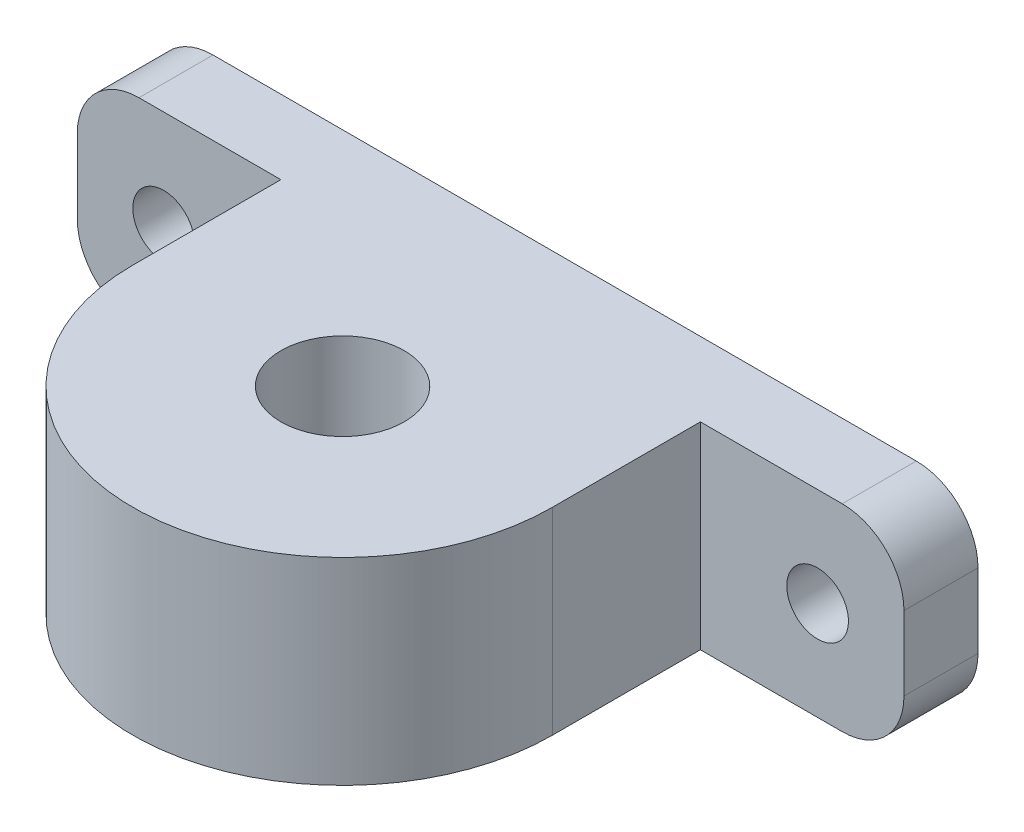
ISO-10303-21;
HEADER;
FILE_DESCRIPTION(('STEP AP214'),'2;1');
FILE_NAME('part.step','',(''),(''),'','','');
FILE_SCHEMA(('AUTOMOTIVE_DESIGN { 1 0 10303 214 1 1 1 1 }'));
ENDSEC;
DATA;
#1=APPLICATION_CONTEXT('core data for automotive mechanical design processes');
#2=APPLICATION_PROTOCOL_DEFINITION('international standard','automotive_design',2000,#1);
#3=PRODUCT_CONTEXT('',#1,'mechanical');
#4=PRODUCT('Part','Part','',(#3));
#5=PRODUCT_RELATED_PRODUCT_CATEGORY('part','',(#4));
#6=PRODUCT_DEFINITION_FORMATION('','',#4);
#7=PRODUCT_DEFINITION_CONTEXT('part definition',#1,'design');
#8=PRODUCT_DEFINITION('design','',#6,#7);
#9=PRODUCT_DEFINITION_SHAPE('','',#8);
#10=(LENGTH_UNIT() NAMED_UNIT(*) SI_UNIT(.MILLI.,.METRE.));
#11=(NAMED_UNIT(*) PLANE_ANGLE_UNIT() SI_UNIT($,.RADIAN.));
#12=(NAMED_UNIT(*) SI_UNIT($,.STERADIAN.) SOLID_ANGLE_UNIT());
#13=UNCERTAINTY_MEASURE_WITH_UNIT(LENGTH_MEASURE(1.E-05),#10,'distance_accuracy_value','');
#14=(GEOMETRIC_REPRESENTATION_CONTEXT(3) GLOBAL_UNCERTAINTY_ASSIGNED_CONTEXT((#13)) GLOBAL_UNIT_ASSIGNED_CONTEXT((#10,
#11,#12)) REPRESENTATION_CONTEXT('',''));
#15=CARTESIAN_POINT('',(0.,0.,0.));
#16=DIRECTION('',(0.,0.,1.));
#17=DIRECTION('',(1.,0.,0.));
#18=AXIS2_PLACEMENT_3D('',#15,#16,#17);
#19=CARTESIAN_POINT('',(-28.5,5.,-9.25000000000002));
#20=DIRECTION('',(0.,0.,-1.));
#21=DIRECTION('',(-1.,0.,0.));
#22=AXIS2_PLACEMENT_3D('',#19,#20,#21);
#23=CYLINDRICAL_SURFACE('',#22,5.);
#24=CARTESIAN_POINT('',(-28.5,5.,-12.));
#25=DIRECTION('',(0.,0.,-1.));
#26=DIRECTION('',(-1.,0.,0.));
#27=AXIS2_PLACEMENT_3D('',#24,#25,#26);
#28=CIRCLE('',#27,5.);
#29=CARTESIAN_POINT('',(-33.5,5.,-12.));
#30=VERTEX_POINT('',#29);
#31=CARTESIAN_POINT('',(-28.5,0.,-12.));
#32=VERTEX_POINT('',#31);
#33=EDGE_CURVE('E172',#30,#32,#28,.F.);
#34=ORIENTED_EDGE('',*,*,#33,.F.);
#35=DIRECTION('',(0.,0.,1.));
#36=VECTOR('',#35,1.);
#37=CARTESIAN_POINT('',(-33.5,5.,-18.));
#38=LINE('',#37,#36);
#39=CARTESIAN_POINT('',(-33.5,5.,-18.));
#40=VERTEX_POINT('',#39);
#41=EDGE_CURVE('E188',#40,#30,#38,.T.);
#42=ORIENTED_EDGE('',*,*,#41,.F.);
#43=CARTESIAN_POINT('',(-28.5,5.,-18.));
#44=DIRECTION('',(0.,0.,-1.));
#45=DIRECTION('',(-1.,0.,0.));
#46=AXIS2_PLACEMENT_3D('',#43,#44,#45);
#47=CIRCLE('',#46,5.);
#48=CARTESIAN_POINT('',(-28.5,0.,-18.));
#49=VERTEX_POINT('',#48);
#50=EDGE_CURVE('E179',#49,#40,#47,.T.);
#51=ORIENTED_EDGE('',*,*,#50,.F.);
#52=DIRECTION('',(0.,0.,1.));
#53=VECTOR('',#52,1.);
#54=CARTESIAN_POINT('',(-28.5,0.,-0.499999999999998));
#55=LINE('',#54,#53);
#56=EDGE_CURVE('E187',#49,#32,#55,.T.);
#57=ORIENTED_EDGE('',*,*,#56,.T.);
#58=EDGE_LOOP('',(#34,#42,#51,#57));
#59=FACE_BOUND('',#58,.T.);
#60=ADVANCED_FACE('F16',(#59),#23,.T.);
#61=CARTESIAN_POINT('',(-33.5,0.,-18.));
#62=DIRECTION('',(-1.,0.,0.));
#63=DIRECTION('',(0.,0.,1.));
#64=AXIS2_PLACEMENT_3D('',#61,#62,#63);
#65=PLANE('',#64);
#66=DIRECTION('',(0.,0.,1.));
#67=VECTOR('',#66,1.);
#68=CARTESIAN_POINT('',(-33.5,11.,-9.25000000000003));
#69=LINE('',#68,#67);
#70=CARTESIAN_POINT('',(-33.5,11.,-18.));
#71=VERTEX_POINT('',#70);
#72=CARTESIAN_POINT('',(-33.5,11.,-12.));
#73=VERTEX_POINT('',#72);
#74=EDGE_CURVE('E201',#71,#73,#69,.T.);
#75=ORIENTED_EDGE('',*,*,#74,.F.);
#76=DIRECTION('',(0.,1.,0.));
#77=VECTOR('',#76,1.);
#78=CARTESIAN_POINT('',(-33.5,0.,-18.));
#79=LINE('',#78,#77);
#80=EDGE_CURVE('E176',#40,#71,#79,.T.);
#81=ORIENTED_EDGE('',*,*,#80,.F.);
#82=ORIENTED_EDGE('',*,*,#41,.T.);
#83=DIRECTION('',(0.,1.,0.));
#84=VECTOR('',#83,1.);
#85=CARTESIAN_POINT('',(-33.5,0.,-12.));
#86=LINE('',#85,#84);
#87=EDGE_CURVE('E164',#73,#30,#86,.F.);
#88=ORIENTED_EDGE('',*,*,#87,.F.);
#89=EDGE_LOOP('',(#75,#81,#82,#88));
#90=FACE_BOUND('',#89,.T.);
#91=ADVANCED_FACE('F247',(#90),#65,.T.);
#92=CARTESIAN_POINT('',(-26.5,8.,-12.));
#93=DIRECTION('',(0.,0.,-1.));
#94=DIRECTION('',(-1.,0.,0.));
#95=AXIS2_PLACEMENT_3D('',#92,#93,#94);
#96=CYLINDRICAL_SURFACE('',#95,2.5);
#97=CARTESIAN_POINT('',(-26.5,8.,-18.));
#98=DIRECTION('',(0.,0.,-1.));
#99=DIRECTION('',(-1.,0.,0.));
#100=AXIS2_PLACEMENT_3D('',#97,#98,#99);
#101=CIRCLE('',#100,2.5);
#102=CARTESIAN_POINT('',(-29.,8.,-18.));
#103=VERTEX_POINT('',#102);
#104=EDGE_CURVE('E178',#103,#103,#101,.F.);
#105=ORIENTED_EDGE('',*,*,#104,.F.);
#106=EDGE_LOOP('',(#105));
#107=FACE_BOUND('',#106,.T.);
#108=CARTESIAN_POINT('',(-26.5,8.,-12.));
#109=DIRECTION('',(0.,0.,-1.));
#110=DIRECTION('',(-1.,0.,0.));
#111=AXIS2_PLACEMENT_3D('',#108,#109,#110);
#112=CIRCLE('',#111,2.5);
#113=CARTESIAN_POINT('',(-29.,8.,-12.));
#114=VERTEX_POINT('',#113);
#115=EDGE_CURVE('E167',#114,#114,#112,.T.);
#116=ORIENTED_EDGE('',*,*,#115,.F.);
#117=EDGE_LOOP('',(#116));
#118=FACE_BOUND('',#117,.T.);
#119=ADVANCED_FACE('F314',(#107,#118),#96,.F.);
#120=CARTESIAN_POINT('',(28.5,5.,-6.25));
#121=DIRECTION('',(0.,0.,1.));
#122=DIRECTION('',(1.,0.,0.));
#123=AXIS2_PLACEMENT_3D('',#120,#121,#122);
#124=CYLINDRICAL_SURFACE('',#123,5.);
#125=CARTESIAN_POINT('',(28.5,5.,-18.));
#126=DIRECTION('',(0.,0.,1.));
#127=DIRECTION('',(1.,0.,0.));
#128=AXIS2_PLACEMENT_3D('',#125,#126,#127);
#129=CIRCLE('',#128,5.);
#130=CARTESIAN_POINT('',(33.5,5.,-18.));
#131=VERTEX_POINT('',#130);
#132=CARTESIAN_POINT('',(28.5,0.,-18.));
#133=VERTEX_POINT('',#132);
#134=EDGE_CURVE('E183',#131,#133,#129,.F.);
#135=ORIENTED_EDGE('',*,*,#134,.F.);
#136=DIRECTION('',(0.,0.,-1.));
#137=VECTOR('',#136,1.);
#138=CARTESIAN_POINT('',(33.5,5.,-12.));
#139=LINE('',#138,#137);
#140=CARTESIAN_POINT('',(33.5,5.,-12.));
#141=VERTEX_POINT('',#140);
#142=EDGE_CURVE('E185',#141,#131,#139,.T.);
#143=ORIENTED_EDGE('',*,*,#142,.F.);
#144=CARTESIAN_POINT('',(28.5,5.,-12.));
#145=DIRECTION('',(0.,0.,1.));
#146=DIRECTION('',(1.,0.,0.));
#147=AXIS2_PLACEMENT_3D('',#144,#145,#146);
#148=CIRCLE('',#147,5.);
#149=CARTESIAN_POINT('',(28.5,0.,-12.));
#150=VERTEX_POINT('',#149);
#151=EDGE_CURVE('E210',#150,#141,#148,.T.);
#152=ORIENTED_EDGE('',*,*,#151,.F.);
#153=DIRECTION('',(0.,0.,1.));
#154=VECTOR('',#153,1.);
#155=CARTESIAN_POINT('',(28.5,0.,-0.499999999999998));
#156=LINE('',#155,#154);
#157=EDGE_CURVE('E189',#150,#133,#156,.F.);
#158=ORIENTED_EDGE('',*,*,#157,.T.);
#159=EDGE_LOOP('',(#135,#143,#152,#158));
#160=FACE_BOUND('',#159,.T.);
#161=ADVANCED_FACE('F233',(#160),#124,.T.);
#162=CARTESIAN_POINT('',(33.5,0.,-12.));
#163=DIRECTION('',(1.,0.,0.));
#164=DIRECTION('',(0.,0.,-1.));
#165=AXIS2_PLACEMENT_3D('',#162,#163,#164);
#166=PLANE('',#165);
#167=ORIENTED_EDGE('',*,*,#142,.T.);
#168=DIRECTION('',(0.,1.,0.));
#169=VECTOR('',#168,1.);
#170=CARTESIAN_POINT('',(33.5,0.,-18.));
#171=LINE('',#170,#169);
#172=CARTESIAN_POINT('',(33.5,11.,-18.));
#173=VERTEX_POINT('',#172);
#174=EDGE_CURVE('E112',#173,#131,#171,.F.);
#175=ORIENTED_EDGE('',*,*,#174,.F.);
#176=DIRECTION('',(0.,0.,-1.));
#177=VECTOR('',#176,1.);
#178=CARTESIAN_POINT('',(33.5,11.,-6.25));
#179=LINE('',#178,#177);
#180=CARTESIAN_POINT('',(33.5,11.,-12.));
#181=VERTEX_POINT('',#180);
#182=EDGE_CURVE('E108',#181,#173,#179,.T.);
#183=ORIENTED_EDGE('',*,*,#182,.F.);
#184=DIRECTION('',(0.,1.,0.));
#185=VECTOR('',#184,1.);
#186=CARTESIAN_POINT('',(33.5,0.,-12.));
#187=LINE('',#186,#185);
#188=EDGE_CURVE('E209',#141,#181,#187,.T.);
#189=ORIENTED_EDGE('',*,*,#188,.F.);
#190=EDGE_LOOP('',(#167,#175,#183,#189));
#191=FACE_BOUND('',#190,.T.);
#192=ADVANCED_FACE('F304',(#191),#166,.T.);
#193=CARTESIAN_POINT('',(26.5,8.,-12.));
#194=DIRECTION('',(0.,0.,-1.));
#195=DIRECTION('',(-1.,0.,0.));
#196=AXIS2_PLACEMENT_3D('',#193,#194,#195);
#197=CYLINDRICAL_SURFACE('',#196,2.5);
#198=CARTESIAN_POINT('',(26.5,8.,-18.));
#199=DIRECTION('',(0.,0.,-1.));
#200=DIRECTION('',(-1.,0.,0.));
#201=AXIS2_PLACEMENT_3D('',#198,#199,#200);
#202=CIRCLE('',#201,2.5);
#203=CARTESIAN_POINT('',(24.,8.,-18.));
#204=VERTEX_POINT('',#203);
#205=EDGE_CURVE('E223',#204,#204,#202,.F.);
#206=ORIENTED_EDGE('',*,*,#205,.F.);
#207=EDGE_LOOP('',(#206));
#208=FACE_BOUND('',#207,.T.);
#209=CARTESIAN_POINT('',(26.5,8.,-12.));
#210=DIRECTION('',(0.,0.,-1.));
#211=DIRECTION('',(-1.,0.,0.));
#212=AXIS2_PLACEMENT_3D('',#209,#210,#211);
#213=CIRCLE('',#212,2.5);
#214=CARTESIAN_POINT('',(24.,8.,-12.));
#215=VERTEX_POINT('',#214);
#216=EDGE_CURVE('E129',#215,#215,#213,.T.);
#217=ORIENTED_EDGE('',*,*,#216,.F.);
#218=EDGE_LOOP('',(#217));
#219=FACE_BOUND('',#218,.T.);
#220=ADVANCED_FACE('F297',(#208,#219),#197,.F.);
#221=CARTESIAN_POINT('',(0.,0.,-0.499999999999998));
#222=DIRECTION('',(0.,1.,0.));
#223=DIRECTION('',(0.,0.,1.));
#224=AXIS2_PLACEMENT_3D('',#221,#222,#223);
#225=PLANE('',#224);
#226=CARTESIAN_POINT('',(0.,0.,0.));
#227=DIRECTION('',(0.,1.,0.));
#228=DIRECTION('',(0.,0.,1.));
#229=AXIS2_PLACEMENT_3D('',#226,#227,#228);
#230=CIRCLE('',#229,5.);
#231=CARTESIAN_POINT('',(0.,0.,5.));
#232=VERTEX_POINT('',#231);
#233=EDGE_CURVE('E126',#232,#232,#230,.T.);
#234=ORIENTED_EDGE('',*,*,#233,.T.);
#235=EDGE_LOOP('',(#234));
#236=FACE_BOUND('',#235,.T.);
#237=DIRECTION('',(1.,0.,0.));
#238=VECTOR('',#237,1.);
#239=CARTESIAN_POINT('',(17.,0.,-12.));
#240=LINE('',#239,#238);
#241=CARTESIAN_POINT('',(17.,0.,-12.));
#242=VERTEX_POINT('',#241);
#243=EDGE_CURVE('E140',#242,#150,#240,.T.);
#244=ORIENTED_EDGE('',*,*,#243,.F.);
#245=DIRECTION('',(0.,0.,-1.));
#246=VECTOR('',#245,1.);
#247=CARTESIAN_POINT('',(17.,0.,0.));
#248=LINE('',#247,#246);
#249=CARTESIAN_POINT('',(17.,0.,0.));
#250=VERTEX_POINT('',#249);
#251=EDGE_CURVE('E147',#250,#242,#248,.T.);
#252=ORIENTED_EDGE('',*,*,#251,.F.);
#253=CARTESIAN_POINT('',(0.,0.,0.));
#254=DIRECTION('',(0.,1.,0.));
#255=DIRECTION('',(0.,0.,1.));
#256=AXIS2_PLACEMENT_3D('',#253,#254,#255);
#257=CIRCLE('',#256,17.);
#258=CARTESIAN_POINT('',(-17.,0.,0.));
#259=VERTEX_POINT('',#258);
#260=EDGE_CURVE('E151',#259,#250,#257,.T.);
#261=ORIENTED_EDGE('',*,*,#260,.F.);
#262=DIRECTION('',(0.,0.,1.));
#263=VECTOR('',#262,1.);
#264=CARTESIAN_POINT('',(-17.,0.,-12.));
#265=LINE('',#264,#263);
#266=CARTESIAN_POINT('',(-17.,0.,-12.));
#267=VERTEX_POINT('',#266);
#268=EDGE_CURVE('E155',#267,#259,#265,.T.);
#269=ORIENTED_EDGE('',*,*,#268,.F.);
#270=DIRECTION('',(1.,0.,0.));
#271=VECTOR('',#270,1.);
#272=CARTESIAN_POINT('',(-33.5,0.,-12.));
#273=LINE('',#272,#271);
#274=EDGE_CURVE('E169',#32,#267,#273,.T.);
#275=ORIENTED_EDGE('',*,*,#274,.F.);
#276=ORIENTED_EDGE('',*,*,#56,.F.);
#277=DIRECTION('',(-1.,0.,0.));
#278=VECTOR('',#277,1.);
#279=CARTESIAN_POINT('',(33.5,0.,-18.));
#280=LINE('',#279,#278);
#281=EDGE_CURVE('E180',#133,#49,#280,.T.);
#282=ORIENTED_EDGE('',*,*,#281,.F.);
#283=ORIENTED_EDGE('',*,*,#157,.F.);
#284=EDGE_LOOP('',(#244,#252,#261,#269,#275,#276,#282,#283));
#285=FACE_BOUND('',#284,.T.);
#286=ADVANCED_FACE('F239',(#236,#285),#225,.F.);
#287=CARTESIAN_POINT('',(28.5,11.,-6.25));
#288=DIRECTION('',(0.,0.,-1.));
#289=DIRECTION('',(-1.,0.,0.));
#290=AXIS2_PLACEMENT_3D('',#287,#288,#289);
#291=CYLINDRICAL_SURFACE('',#290,5.);
#292=CARTESIAN_POINT('',(28.5,11.,-12.));
#293=DIRECTION('',(0.,0.,-1.));
#294=DIRECTION('',(-1.,0.,0.));
#295=AXIS2_PLACEMENT_3D('',#292,#293,#294);
#296=CIRCLE('',#295,5.);
#297=CARTESIAN_POINT('',(28.5,16.,-12.));
#298=VERTEX_POINT('',#297);
#299=EDGE_CURVE('E141',#181,#298,#296,.F.);
#300=ORIENTED_EDGE('',*,*,#299,.F.);
#301=ORIENTED_EDGE('',*,*,#182,.T.);
#302=CARTESIAN_POINT('',(28.5,11.,-18.));
#303=DIRECTION('',(0.,0.,-1.));
#304=DIRECTION('',(-1.,0.,0.));
#305=AXIS2_PLACEMENT_3D('',#302,#303,#304);
#306=CIRCLE('',#305,5.);
#307=CARTESIAN_POINT('',(28.5,16.,-18.));
#308=VERTEX_POINT('',#307);
#309=EDGE_CURVE('E19',#308,#173,#306,.T.);
#310=ORIENTED_EDGE('',*,*,#309,.F.);
#311=DIRECTION('',(0.,0.,1.));
#312=VECTOR('',#311,1.);
#313=CARTESIAN_POINT('',(28.5,16.,-0.499999999999998));
#314=LINE('',#313,#312);
#315=EDGE_CURVE('E106',#298,#308,#314,.F.);
#316=ORIENTED_EDGE('',*,*,#315,.F.);
#317=EDGE_LOOP('',(#300,#301,#310,#316));
#318=FACE_BOUND('',#317,.T.);
#319=ADVANCED_FACE('F104',(#318),#291,.T.);
#320=CARTESIAN_POINT('',(33.5,0.,-18.));
#321=DIRECTION('',(0.,0.,-1.));
#322=DIRECTION('',(-1.,0.,0.));
#323=AXIS2_PLACEMENT_3D('',#320,#321,#322);
#324=PLANE('',#323);
#325=ORIENTED_EDGE('',*,*,#205,.T.);
#326=EDGE_LOOP('',(#325));
#327=FACE_BOUND('',#326,.T.);
#328=ORIENTED_EDGE('',*,*,#104,.T.);
#329=EDGE_LOOP('',(#328));
#330=FACE_BOUND('',#329,.T.);
#331=CARTESIAN_POINT('',(-28.5,11.,-18.));
#332=DIRECTION('',(0.,0.,1.));
#333=DIRECTION('',(1.,0.,0.));
#334=AXIS2_PLACEMENT_3D('',#331,#332,#333);
#335=CIRCLE('',#334,5.);
#336=CARTESIAN_POINT('',(-28.5,16.,-18.));
#337=VERTEX_POINT('',#336);
#338=EDGE_CURVE('E117',#337,#71,#335,.T.);
#339=ORIENTED_EDGE('',*,*,#338,.F.);
#340=DIRECTION('',(1.,0.,0.));
#341=VECTOR('',#340,1.);
#342=CARTESIAN_POINT('',(0.,16.,-18.));
#343=LINE('',#342,#341);
#344=EDGE_CURVE('E114',#308,#337,#343,.F.);
#345=ORIENTED_EDGE('',*,*,#344,.F.);
#346=ORIENTED_EDGE('',*,*,#309,.T.);
#347=ORIENTED_EDGE('',*,*,#174,.T.);
#348=ORIENTED_EDGE('',*,*,#134,.T.);
#349=ORIENTED_EDGE('',*,*,#281,.T.);
#350=ORIENTED_EDGE('',*,*,#50,.T.);
#351=ORIENTED_EDGE('',*,*,#80,.T.);
#352=EDGE_LOOP('',(#339,#345,#346,#347,#348,#349,#350,#351));
#353=FACE_BOUND('',#352,.T.);
#354=ADVANCED_FACE('F115',(#327,#330,#353),#324,.T.);
#355=CARTESIAN_POINT('',(-28.5,11.,-9.25000000000002));
#356=DIRECTION('',(0.,0.,1.));
#357=DIRECTION('',(1.,0.,0.));
#358=AXIS2_PLACEMENT_3D('',#355,#356,#357);
#359=CYLINDRICAL_SURFACE('',#358,5.);
#360=ORIENTED_EDGE('',*,*,#338,.T.);
#361=ORIENTED_EDGE('',*,*,#74,.T.);
#362=CARTESIAN_POINT('',(-28.5,11.,-12.));
#363=DIRECTION('',(0.,0.,1.));
#364=DIRECTION('',(1.,0.,0.));
#365=AXIS2_PLACEMENT_3D('',#362,#363,#364);
#366=CIRCLE('',#365,5.);
#367=CARTESIAN_POINT('',(-28.5,16.,-12.));
#368=VERTEX_POINT('',#367);
#369=EDGE_CURVE('E168',#368,#73,#366,.T.);
#370=ORIENTED_EDGE('',*,*,#369,.F.);
#371=DIRECTION('',(0.,0.,1.));
#372=VECTOR('',#371,1.);
#373=CARTESIAN_POINT('',(-28.5,16.,-0.499999999999998));
#374=LINE('',#373,#372);
#375=EDGE_CURVE('E121',#337,#368,#374,.T.);
#376=ORIENTED_EDGE('',*,*,#375,.F.);
#377=EDGE_LOOP('',(#360,#361,#370,#376));
#378=FACE_BOUND('',#377,.T.);
#379=ADVANCED_FACE('F249',(#378),#359,.T.);
#380=CARTESIAN_POINT('',(-33.5,0.,-12.));
#381=DIRECTION('',(0.,0.,1.));
#382=DIRECTION('',(1.,0.,0.));
#383=AXIS2_PLACEMENT_3D('',#380,#381,#382);
#384=PLANE('',#383);
#385=ORIENTED_EDGE('',*,*,#115,.T.);
#386=EDGE_LOOP('',(#385));
#387=FACE_BOUND('',#386,.T.);
#388=ORIENTED_EDGE('',*,*,#369,.T.);
#389=ORIENTED_EDGE('',*,*,#87,.T.);
#390=ORIENTED_EDGE('',*,*,#33,.T.);
#391=ORIENTED_EDGE('',*,*,#274,.T.);
#392=DIRECTION('',(0.,1.,0.));
#393=VECTOR('',#392,1.);
#394=CARTESIAN_POINT('',(-17.,0.,-12.));
#395=LINE('',#394,#393);
#396=CARTESIAN_POINT('',(-17.,16.,-12.));
#397=VERTEX_POINT('',#396);
#398=EDGE_CURVE('E152',#397,#267,#395,.F.);
#399=ORIENTED_EDGE('',*,*,#398,.F.);
#400=DIRECTION('',(1.,0.,0.));
#401=VECTOR('',#400,1.);
#402=CARTESIAN_POINT('',(0.,16.,-12.));
#403=LINE('',#402,#401);
#404=EDGE_CURVE('E158',#368,#397,#403,.T.);
#405=ORIENTED_EDGE('',*,*,#404,.F.);
#406=EDGE_LOOP('',(#388,#389,#390,#391,#399,#405));
#407=FACE_BOUND('',#406,.T.);
#408=ADVANCED_FACE('F254',(#387,#407),#384,.T.);
#409=CARTESIAN_POINT('',(-17.,0.,-12.));
#410=DIRECTION('',(-1.,0.,0.));
#411=DIRECTION('',(0.,0.,1.));
#412=AXIS2_PLACEMENT_3D('',#409,#410,#411);
#413=PLANE('',#412);
#414=DIRECTION('',(0.,0.,1.));
#415=VECTOR('',#414,1.);
#416=CARTESIAN_POINT('',(-17.,16.,-0.499999999999998));
#417=LINE('',#416,#415);
#418=CARTESIAN_POINT('',(-17.,16.,0.));
#419=VERTEX_POINT('',#418);
#420=EDGE_CURVE('E161',#397,#419,#417,.T.);
#421=ORIENTED_EDGE('',*,*,#420,.F.);
#422=ORIENTED_EDGE('',*,*,#398,.T.);
#423=ORIENTED_EDGE('',*,*,#268,.T.);
#424=DIRECTION('',(0.,1.,0.));
#425=VECTOR('',#424,1.);
#426=CARTESIAN_POINT('',(-17.,0.,0.));
#427=LINE('',#426,#425);
#428=EDGE_CURVE('E148',#419,#259,#427,.F.);
#429=ORIENTED_EDGE('',*,*,#428,.F.);
#430=EDGE_LOOP('',(#421,#422,#423,#429));
#431=FACE_BOUND('',#430,.T.);
#432=ADVANCED_FACE('F256',(#431),#413,.T.);
#433=CARTESIAN_POINT('',(0.,0.,0.));
#434=DIRECTION('',(0.,1.,0.));
#435=DIRECTION('',(0.,0.,1.));
#436=AXIS2_PLACEMENT_3D('',#433,#434,#435);
#437=CYLINDRICAL_SURFACE('',#436,17.);
#438=CARTESIAN_POINT('',(0.,16.,0.));
#439=DIRECTION('',(0.,1.,0.));
#440=DIRECTION('',(0.,0.,1.));
#441=AXIS2_PLACEMENT_3D('',#438,#439,#440);
#442=CIRCLE('',#441,17.);
#443=CARTESIAN_POINT('',(17.,16.,0.));
#444=VERTEX_POINT('',#443);
#445=EDGE_CURVE('E204',#419,#444,#442,.T.);
#446=ORIENTED_EDGE('',*,*,#445,.F.);
#447=ORIENTED_EDGE('',*,*,#428,.T.);
#448=ORIENTED_EDGE('',*,*,#260,.T.);
#449=DIRECTION('',(0.,1.,0.));
#450=VECTOR('',#449,1.);
#451=CARTESIAN_POINT('',(17.,0.,0.));
#452=LINE('',#451,#450);
#453=EDGE_CURVE('E144',#444,#250,#452,.F.);
#454=ORIENTED_EDGE('',*,*,#453,.F.);
#455=EDGE_LOOP('',(#446,#447,#448,#454));
#456=FACE_BOUND('',#455,.T.);
#457=ADVANCED_FACE('F269',(#456),#437,.T.);
#458=CARTESIAN_POINT('',(17.,0.,0.));
#459=DIRECTION('',(1.,0.,0.));
#460=DIRECTION('',(0.,0.,-1.));
#461=AXIS2_PLACEMENT_3D('',#458,#459,#460);
#462=PLANE('',#461);
#463=DIRECTION('',(0.,0.,1.));
#464=VECTOR('',#463,1.);
#465=CARTESIAN_POINT('',(17.,16.,-0.499999999999998));
#466=LINE('',#465,#464);
#467=CARTESIAN_POINT('',(17.,16.,-12.));
#468=VERTEX_POINT('',#467);
#469=EDGE_CURVE('E136',#444,#468,#466,.F.);
#470=ORIENTED_EDGE('',*,*,#469,.F.);
#471=ORIENTED_EDGE('',*,*,#453,.T.);
#472=ORIENTED_EDGE('',*,*,#251,.T.);
#473=DIRECTION('',(0.,1.,0.));
#474=VECTOR('',#473,1.);
#475=CARTESIAN_POINT('',(17.,0.,-12.));
#476=LINE('',#475,#474);
#477=EDGE_CURVE('E34',#468,#242,#476,.F.);
#478=ORIENTED_EDGE('',*,*,#477,.F.);
#479=EDGE_LOOP('',(#470,#471,#472,#478));
#480=FACE_BOUND('',#479,.T.);
#481=ADVANCED_FACE('F270',(#480),#462,.T.);
#482=CARTESIAN_POINT('',(17.,0.,-12.));
#483=DIRECTION('',(0.,0.,1.));
#484=DIRECTION('',(1.,0.,0.));
#485=AXIS2_PLACEMENT_3D('',#482,#483,#484);
#486=PLANE('',#485);
#487=ORIENTED_EDGE('',*,*,#216,.T.);
#488=EDGE_LOOP('',(#487));
#489=FACE_BOUND('',#488,.T.);
#490=ORIENTED_EDGE('',*,*,#151,.T.);
#491=ORIENTED_EDGE('',*,*,#188,.T.);
#492=ORIENTED_EDGE('',*,*,#299,.T.);
#493=DIRECTION('',(1.,0.,0.));
#494=VECTOR('',#493,1.);
#495=CARTESIAN_POINT('',(0.,16.,-12.));
#496=LINE('',#495,#494);
#497=EDGE_CURVE('E25',#468,#298,#496,.T.);
#498=ORIENTED_EDGE('',*,*,#497,.F.);
#499=ORIENTED_EDGE('',*,*,#477,.T.);
#500=ORIENTED_EDGE('',*,*,#243,.T.);
#501=EDGE_LOOP('',(#490,#491,#492,#498,#499,#500));
#502=FACE_BOUND('',#501,.T.);
#503=ADVANCED_FACE('F267',(#489,#502),#486,.T.);
#504=CARTESIAN_POINT('',(0.,0.,0.));
#505=DIRECTION('',(0.,1.,0.));
#506=DIRECTION('',(0.,0.,1.));
#507=AXIS2_PLACEMENT_3D('',#504,#505,#506);
#508=CYLINDRICAL_SURFACE('',#507,5.);
#509=ORIENTED_EDGE('',*,*,#233,.F.);
#510=EDGE_LOOP('',(#509));
#511=FACE_BOUND('',#510,.T.);
#512=CARTESIAN_POINT('',(0.,16.,0.));
#513=DIRECTION('',(0.,1.,0.));
#514=DIRECTION('',(0.,0.,1.));
#515=AXIS2_PLACEMENT_3D('',#512,#513,#514);
#516=CIRCLE('',#515,5.);
#517=CARTESIAN_POINT('',(0.,16.,5.));
#518=VERTEX_POINT('',#517);
#519=EDGE_CURVE('E11',#518,#518,#516,.F.);
#520=ORIENTED_EDGE('',*,*,#519,.F.);
#521=EDGE_LOOP('',(#520));
#522=FACE_BOUND('',#521,.T.);
#523=ADVANCED_FACE('F278',(#511,#522),#508,.F.);
#524=CARTESIAN_POINT('',(0.,16.,-0.499999999999998));
#525=DIRECTION('',(0.,1.,0.));
#526=DIRECTION('',(0.,0.,1.));
#527=AXIS2_PLACEMENT_3D('',#524,#525,#526);
#528=PLANE('',#527);
#529=ORIENTED_EDGE('',*,*,#519,.T.);
#530=EDGE_LOOP('',(#529));
#531=FACE_BOUND('',#530,.T.);
#532=ORIENTED_EDGE('',*,*,#469,.T.);
#533=ORIENTED_EDGE('',*,*,#497,.T.);
#534=ORIENTED_EDGE('',*,*,#315,.T.);
#535=ORIENTED_EDGE('',*,*,#344,.T.);
#536=ORIENTED_EDGE('',*,*,#375,.T.);
#537=ORIENTED_EDGE('',*,*,#404,.T.);
#538=ORIENTED_EDGE('',*,*,#420,.T.);
#539=ORIENTED_EDGE('',*,*,#445,.T.);
#540=EDGE_LOOP('',(#532,#533,#534,#535,#536,#537,#538,#539));
#541=FACE_BOUND('',#540,.T.);
#542=ADVANCED_FACE('F125',(#531,#541),#528,.T.);
#543=CLOSED_SHELL('',(#60,#91,#119,#161,#192,#220,#286,#319,#354,#379,#408,#432,#457,#481,#503,
#523,#542));
#544=MANIFOLD_SOLID_BREP('B1',#543);
#545=ADVANCED_BREP_SHAPE_REPRESENTATION('',(#18,#544),#14);
#546=SHAPE_DEFINITION_REPRESENTATION(#9,#545);
ENDSEC;
END-ISO-10303-21;
